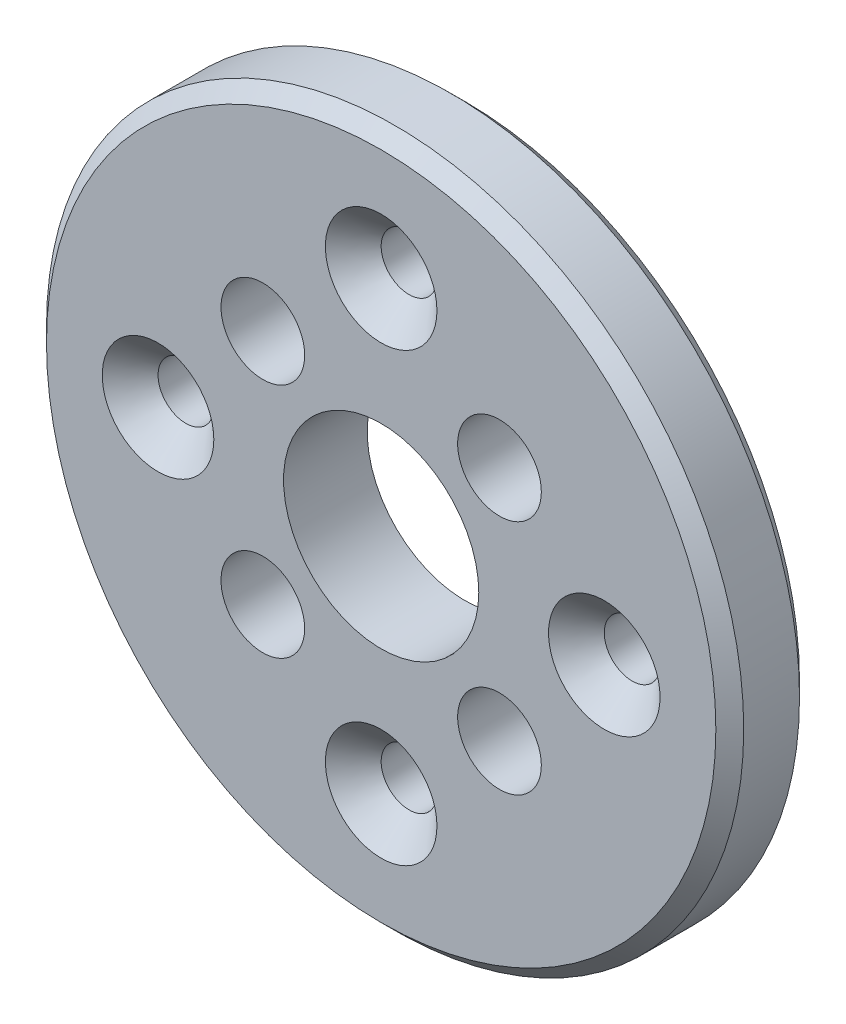
ISO-10303-21;
HEADER;
FILE_DESCRIPTION(('STEP AP214'),'2;1');
FILE_NAME('part.step','',(''),(''),'','','');
FILE_SCHEMA(('AUTOMOTIVE_DESIGN { 1 0 10303 214 1 1 1 1 }'));
ENDSEC;
DATA;
#1=APPLICATION_CONTEXT('core data for automotive mechanical design processes');
#2=APPLICATION_PROTOCOL_DEFINITION('international standard','automotive_design',2000,#1);
#3=PRODUCT_CONTEXT('',#1,'mechanical');
#4=PRODUCT('Part','Part','',(#3));
#5=PRODUCT_RELATED_PRODUCT_CATEGORY('part','',(#4));
#6=PRODUCT_DEFINITION_FORMATION('','',#4);
#7=PRODUCT_DEFINITION_CONTEXT('part definition',#1,'design');
#8=PRODUCT_DEFINITION('design','',#6,#7);
#9=PRODUCT_DEFINITION_SHAPE('','',#8);
#10=(LENGTH_UNIT() NAMED_UNIT(*) SI_UNIT(.MILLI.,.METRE.));
#11=(NAMED_UNIT(*) PLANE_ANGLE_UNIT() SI_UNIT($,.RADIAN.));
#12=(NAMED_UNIT(*) SI_UNIT($,.STERADIAN.) SOLID_ANGLE_UNIT());
#13=UNCERTAINTY_MEASURE_WITH_UNIT(LENGTH_MEASURE(1.E-05),#10,'distance_accuracy_value','');
#14=(GEOMETRIC_REPRESENTATION_CONTEXT(3) GLOBAL_UNCERTAINTY_ASSIGNED_CONTEXT((#13)) GLOBAL_UNIT_ASSIGNED_CONTEXT((#10,
#11,#12)) REPRESENTATION_CONTEXT('',''));
#15=CARTESIAN_POINT('',(0.,0.,0.));
#16=DIRECTION('',(0.,0.,1.));
#17=DIRECTION('',(1.,0.,0.));
#18=AXIS2_PLACEMENT_3D('',#15,#16,#17);
#19=CARTESIAN_POINT('',(0.,0.,1.5));
#20=DIRECTION('',(0.,0.,1.));
#21=DIRECTION('',(1.,0.,0.));
#22=AXIS2_PLACEMENT_3D('',#19,#20,#21);
#23=PLANE('',#22);
#24=CARTESIAN_POINT('',(0.,0.,1.5));
#25=DIRECTION('',(0.,0.,1.));
#26=DIRECTION('',(1.,0.,0.));
#27=AXIS2_PLACEMENT_3D('',#24,#25,#26);
#28=CIRCLE('',#27,12.);
#29=CARTESIAN_POINT('',(12.,0.,1.5));
#30=VERTEX_POINT('',#29);
#31=EDGE_CURVE('E10',#30,#30,#28,.T.);
#32=ORIENTED_EDGE('',*,*,#31,.T.);
#33=EDGE_LOOP('',(#32));
#34=FACE_BOUND('',#33,.T.);
#35=CARTESIAN_POINT('',(8.00000000000023,2.25904099284255E-13,1.5));
#36=DIRECTION('',(0.,0.,1.));
#37=DIRECTION('',(1.,0.,0.));
#38=AXIS2_PLACEMENT_3D('',#35,#36,#37);
#39=CIRCLE('',#38,2.00000000000018);
#40=CARTESIAN_POINT('',(10.0000000000004,2.25904099284255E-13,1.5));
#41=VERTEX_POINT('',#40);
#42=EDGE_CURVE('E78',#41,#41,#39,.F.);
#43=ORIENTED_EDGE('',*,*,#42,.T.);
#44=EDGE_LOOP('',(#43));
#45=FACE_BOUND('',#44,.T.);
#46=CARTESIAN_POINT('',(4.51808198568511E-13,-8.,1.5));
#47=DIRECTION('',(0.,0.,1.));
#48=DIRECTION('',(1.,0.,0.));
#49=AXIS2_PLACEMENT_3D('',#46,#47,#48);
#50=CIRCLE('',#49,2.00000000000049);
#51=CARTESIAN_POINT('',(2.00000000000094,-8.,1.5));
#52=VERTEX_POINT('',#51);
#53=EDGE_CURVE('E82',#52,#52,#50,.F.);
#54=ORIENTED_EDGE('',*,*,#53,.T.);
#55=EDGE_LOOP('',(#54));
#56=FACE_BOUND('',#55,.T.);
#57=CARTESIAN_POINT('',(-7.99999999999977,-2.26883816723573E-13,1.5));
#58=DIRECTION('',(0.,0.,1.));
#59=DIRECTION('',(1.,0.,0.));
#60=AXIS2_PLACEMENT_3D('',#57,#58,#59);
#61=CIRCLE('',#60,2.00000000000037);
#62=CARTESIAN_POINT('',(-5.99999999999941,-2.26883816723573E-13,1.5));
#63=VERTEX_POINT('',#62);
#64=EDGE_CURVE('E86',#63,#63,#61,.F.);
#65=ORIENTED_EDGE('',*,*,#64,.T.);
#66=EDGE_LOOP('',(#65));
#67=FACE_BOUND('',#66,.T.);
#68=CARTESIAN_POINT('',(0.,8.,1.5));
#69=DIRECTION('',(0.,0.,1.));
#70=DIRECTION('',(1.,0.,0.));
#71=AXIS2_PLACEMENT_3D('',#68,#69,#70);
#72=CIRCLE('',#71,2.);
#73=CARTESIAN_POINT('',(2.,8.,1.5));
#74=VERTEX_POINT('',#73);
#75=EDGE_CURVE('E90',#74,#74,#72,.F.);
#76=ORIENTED_EDGE('',*,*,#75,.T.);
#77=EDGE_LOOP('',(#76));
#78=FACE_BOUND('',#77,.T.);
#79=CARTESIAN_POINT('',(4.24264068711926,-4.24264068711931,1.5));
#80=DIRECTION('',(0.,0.,1.));
#81=DIRECTION('',(1.,0.,0.));
#82=AXIS2_PLACEMENT_3D('',#79,#80,#81);
#83=CIRCLE('',#82,1.5);
#84=CARTESIAN_POINT('',(5.74264068711926,-4.24264068711931,1.5));
#85=VERTEX_POINT('',#84);
#86=EDGE_CURVE('E135',#85,#85,#83,.T.);
#87=ORIENTED_EDGE('',*,*,#86,.F.);
#88=EDGE_LOOP('',(#87));
#89=FACE_BOUND('',#88,.T.);
#90=CARTESIAN_POINT('',(0.,0.,1.5));
#91=DIRECTION('',(0.,0.,1.));
#92=DIRECTION('',(1.,0.,0.));
#93=AXIS2_PLACEMENT_3D('',#90,#91,#92);
#94=CIRCLE('',#93,3.5);
#95=CARTESIAN_POINT('',(3.5,0.,1.5));
#96=VERTEX_POINT('',#95);
#97=EDGE_CURVE('E119',#96,#96,#94,.T.);
#98=ORIENTED_EDGE('',*,*,#97,.F.);
#99=EDGE_LOOP('',(#98));
#100=FACE_BOUND('',#99,.T.);
#101=CARTESIAN_POINT('',(-4.24264068711929,4.24264068711928,1.5));
#102=DIRECTION('',(0.,0.,1.));
#103=DIRECTION('',(1.,0.,0.));
#104=AXIS2_PLACEMENT_3D('',#101,#102,#103);
#105=CIRCLE('',#104,1.5);
#106=CARTESIAN_POINT('',(-2.74264068711929,4.24264068711928,1.5));
#107=VERTEX_POINT('',#106);
#108=EDGE_CURVE('E114',#107,#107,#105,.T.);
#109=ORIENTED_EDGE('',*,*,#108,.F.);
#110=EDGE_LOOP('',(#109));
#111=FACE_BOUND('',#110,.T.);
#112=CARTESIAN_POINT('',(4.24264068711929,4.24264068711928,1.5));
#113=DIRECTION('',(0.,0.,1.));
#114=DIRECTION('',(1.,0.,0.));
#115=AXIS2_PLACEMENT_3D('',#112,#113,#114);
#116=CIRCLE('',#115,1.5);
#117=CARTESIAN_POINT('',(5.74264068711929,4.24264068711928,1.5));
#118=VERTEX_POINT('',#117);
#119=EDGE_CURVE('E127',#118,#118,#116,.T.);
#120=ORIENTED_EDGE('',*,*,#119,.F.);
#121=EDGE_LOOP('',(#120));
#122=FACE_BOUND('',#121,.T.);
#123=CARTESIAN_POINT('',(-4.24264068711932,-4.24264068711925,1.5));
#124=DIRECTION('',(0.,0.,1.));
#125=DIRECTION('',(1.,0.,0.));
#126=AXIS2_PLACEMENT_3D('',#123,#124,#125);
#127=CIRCLE('',#126,1.5);
#128=CARTESIAN_POINT('',(-2.74264068711932,-4.24264068711925,1.5));
#129=VERTEX_POINT('',#128);
#130=EDGE_CURVE('E143',#129,#129,#127,.T.);
#131=ORIENTED_EDGE('',*,*,#130,.F.);
#132=EDGE_LOOP('',(#131));
#133=FACE_BOUND('',#132,.T.);
#134=ADVANCED_FACE('F41',(#34,#45,#56,#67,#78,#89,#100,#111,#122,#133),#23,.T.);
#135=CARTESIAN_POINT('',(0.,0.,-1.5));
#136=DIRECTION('',(0.,0.,1.));
#137=DIRECTION('',(1.,0.,0.));
#138=AXIS2_PLACEMENT_3D('',#135,#136,#137);
#139=PLANE('',#138);
#140=CARTESIAN_POINT('',(0.,0.,-1.5));
#141=DIRECTION('',(0.,0.,1.));
#142=DIRECTION('',(1.,0.,0.));
#143=AXIS2_PLACEMENT_3D('',#140,#141,#142);
#144=CIRCLE('',#143,12.);
#145=CARTESIAN_POINT('',(12.,0.,-1.5));
#146=VERTEX_POINT('',#145);
#147=EDGE_CURVE('E50',#146,#146,#144,.F.);
#148=ORIENTED_EDGE('',*,*,#147,.T.);
#149=EDGE_LOOP('',(#148));
#150=FACE_BOUND('',#149,.T.);
#151=CARTESIAN_POINT('',(0.,8.,-1.5));
#152=DIRECTION('',(0.,0.,1.));
#153=DIRECTION('',(1.,0.,0.));
#154=AXIS2_PLACEMENT_3D('',#151,#152,#153);
#155=CIRCLE('',#154,1.);
#156=CARTESIAN_POINT('',(1.,8.,-1.5));
#157=VERTEX_POINT('',#156);
#158=EDGE_CURVE('E98',#157,#157,#155,.T.);
#159=ORIENTED_EDGE('',*,*,#158,.T.);
#160=EDGE_LOOP('',(#159));
#161=FACE_BOUND('',#160,.T.);
#162=CARTESIAN_POINT('',(8.00000000000023,2.25904099284255E-13,-1.5));
#163=DIRECTION('',(0.,0.,1.));
#164=DIRECTION('',(1.,0.,0.));
#165=AXIS2_PLACEMENT_3D('',#162,#163,#164);
#166=CIRCLE('',#165,1.00000000000018);
#167=CARTESIAN_POINT('',(9.0000000000004,2.25904099284255E-13,-1.5));
#168=VERTEX_POINT('',#167);
#169=EDGE_CURVE('E102',#168,#168,#166,.T.);
#170=ORIENTED_EDGE('',*,*,#169,.T.);
#171=EDGE_LOOP('',(#170));
#172=FACE_BOUND('',#171,.T.);
#173=CARTESIAN_POINT('',(4.51808198568511E-13,-8.,-1.5));
#174=DIRECTION('',(0.,0.,1.));
#175=DIRECTION('',(1.,0.,0.));
#176=AXIS2_PLACEMENT_3D('',#173,#174,#175);
#177=CIRCLE('',#176,1.00000000000049);
#178=CARTESIAN_POINT('',(1.00000000000094,-8.,-1.5));
#179=VERTEX_POINT('',#178);
#180=EDGE_CURVE('E106',#179,#179,#177,.T.);
#181=ORIENTED_EDGE('',*,*,#180,.T.);
#182=EDGE_LOOP('',(#181));
#183=FACE_BOUND('',#182,.T.);
#184=CARTESIAN_POINT('',(-7.99999999999977,-2.26883816723573E-13,-1.5));
#185=DIRECTION('',(0.,0.,1.));
#186=DIRECTION('',(1.,0.,0.));
#187=AXIS2_PLACEMENT_3D('',#184,#185,#186);
#188=CIRCLE('',#187,1.00000000000036);
#189=CARTESIAN_POINT('',(-6.99999999999941,-2.26883816723573E-13,-1.5));
#190=VERTEX_POINT('',#189);
#191=EDGE_CURVE('E110',#190,#190,#188,.T.);
#192=ORIENTED_EDGE('',*,*,#191,.T.);
#193=EDGE_LOOP('',(#192));
#194=FACE_BOUND('',#193,.T.);
#195=CARTESIAN_POINT('',(-4.24264068711929,4.24264068711928,-1.5));
#196=DIRECTION('',(0.,0.,1.));
#197=DIRECTION('',(1.,0.,0.));
#198=AXIS2_PLACEMENT_3D('',#195,#196,#197);
#199=CIRCLE('',#198,1.5);
#200=CARTESIAN_POINT('',(-2.74264068711929,4.24264068711928,-1.5));
#201=VERTEX_POINT('',#200);
#202=EDGE_CURVE('E115',#201,#201,#199,.T.);
#203=ORIENTED_EDGE('',*,*,#202,.T.);
#204=EDGE_LOOP('',(#203));
#205=FACE_BOUND('',#204,.T.);
#206=CARTESIAN_POINT('',(0.,0.,-1.5));
#207=DIRECTION('',(0.,0.,1.));
#208=DIRECTION('',(1.,0.,0.));
#209=AXIS2_PLACEMENT_3D('',#206,#207,#208);
#210=CIRCLE('',#209,3.5);
#211=CARTESIAN_POINT('',(3.5,0.,-1.5));
#212=VERTEX_POINT('',#211);
#213=EDGE_CURVE('E123',#212,#212,#210,.T.);
#214=ORIENTED_EDGE('',*,*,#213,.T.);
#215=EDGE_LOOP('',(#214));
#216=FACE_BOUND('',#215,.T.);
#217=CARTESIAN_POINT('',(4.24264068711929,4.24264068711928,-1.5));
#218=DIRECTION('',(0.,0.,1.));
#219=DIRECTION('',(1.,0.,0.));
#220=AXIS2_PLACEMENT_3D('',#217,#218,#219);
#221=CIRCLE('',#220,1.5);
#222=CARTESIAN_POINT('',(5.74264068711929,4.24264068711928,-1.5));
#223=VERTEX_POINT('',#222);
#224=EDGE_CURVE('E131',#223,#223,#221,.T.);
#225=ORIENTED_EDGE('',*,*,#224,.T.);
#226=EDGE_LOOP('',(#225));
#227=FACE_BOUND('',#226,.T.);
#228=CARTESIAN_POINT('',(4.24264068711926,-4.24264068711931,-1.5));
#229=DIRECTION('',(0.,0.,1.));
#230=DIRECTION('',(1.,0.,0.));
#231=AXIS2_PLACEMENT_3D('',#228,#229,#230);
#232=CIRCLE('',#231,1.5);
#233=CARTESIAN_POINT('',(5.74264068711926,-4.24264068711931,-1.5));
#234=VERTEX_POINT('',#233);
#235=EDGE_CURVE('E139',#234,#234,#232,.T.);
#236=ORIENTED_EDGE('',*,*,#235,.T.);
#237=EDGE_LOOP('',(#236));
#238=FACE_BOUND('',#237,.T.);
#239=CARTESIAN_POINT('',(-4.24264068711932,-4.24264068711925,-1.5));
#240=DIRECTION('',(0.,0.,1.));
#241=DIRECTION('',(1.,0.,0.));
#242=AXIS2_PLACEMENT_3D('',#239,#240,#241);
#243=CIRCLE('',#242,1.5);
#244=CARTESIAN_POINT('',(-2.74264068711932,-4.24264068711925,-1.5));
#245=VERTEX_POINT('',#244);
#246=EDGE_CURVE('E147',#245,#245,#243,.T.);
#247=ORIENTED_EDGE('',*,*,#246,.T.);
#248=EDGE_LOOP('',(#247));
#249=FACE_BOUND('',#248,.T.);
#250=ADVANCED_FACE('F159',(#150,#161,#172,#183,#194,#205,#216,#227,#238,#249),#139,.F.);
#251=CARTESIAN_POINT('',(0.,0.,1.5));
#252=DIRECTION('',(0.,0.,-1.));
#253=DIRECTION('',(-1.,0.,0.));
#254=AXIS2_PLACEMENT_3D('',#251,#252,#253);
#255=CYLINDRICAL_SURFACE('',#254,12.5);
#256=CARTESIAN_POINT('',(0.,0.,-0.999999999999998));
#257=DIRECTION('',(0.,0.,1.));
#258=DIRECTION('',(1.,0.,0.));
#259=AXIS2_PLACEMENT_3D('',#256,#257,#258);
#260=CIRCLE('',#259,12.5);
#261=CARTESIAN_POINT('',(12.5,0.,-0.999999999999998));
#262=VERTEX_POINT('',#261);
#263=EDGE_CURVE('E55',#262,#262,#260,.T.);
#264=ORIENTED_EDGE('',*,*,#263,.T.);
#265=EDGE_LOOP('',(#264));
#266=FACE_BOUND('',#265,.T.);
#267=CARTESIAN_POINT('',(0.,0.,0.999999999999998));
#268=DIRECTION('',(0.,0.,1.));
#269=DIRECTION('',(1.,0.,0.));
#270=AXIS2_PLACEMENT_3D('',#267,#268,#269);
#271=CIRCLE('',#270,12.5);
#272=CARTESIAN_POINT('',(12.5,0.,0.999999999999998));
#273=VERTEX_POINT('',#272);
#274=EDGE_CURVE('E60',#273,#273,#271,.F.);
#275=ORIENTED_EDGE('',*,*,#274,.T.);
#276=EDGE_LOOP('',(#275));
#277=FACE_BOUND('',#276,.T.);
#278=ADVANCED_FACE('F164',(#266,#277),#255,.T.);
#279=CARTESIAN_POINT('',(0.,8.,1.5));
#280=DIRECTION('',(0.,0.,-1.));
#281=DIRECTION('',(-1.,0.,0.));
#282=AXIS2_PLACEMENT_3D('',#279,#280,#281);
#283=CYLINDRICAL_SURFACE('',#282,1.);
#284=CARTESIAN_POINT('',(0.,8.,0.500000000000002));
#285=DIRECTION('',(0.,0.,1.));
#286=DIRECTION('',(1.,0.,0.));
#287=AXIS2_PLACEMENT_3D('',#284,#285,#286);
#288=CIRCLE('',#287,1.);
#289=CARTESIAN_POINT('',(1.,8.,0.500000000000002));
#290=VERTEX_POINT('',#289);
#291=EDGE_CURVE('E66',#290,#290,#288,.T.);
#292=ORIENTED_EDGE('',*,*,#291,.T.);
#293=EDGE_LOOP('',(#292));
#294=FACE_BOUND('',#293,.T.);
#295=ORIENTED_EDGE('',*,*,#158,.F.);
#296=EDGE_LOOP('',(#295));
#297=FACE_BOUND('',#296,.T.);
#298=ADVANCED_FACE('F168',(#294,#297),#283,.F.);
#299=CARTESIAN_POINT('',(8.00000000000023,2.25904099284255E-13,1.5));
#300=DIRECTION('',(0.,0.,-1.));
#301=DIRECTION('',(-1.,0.,0.));
#302=AXIS2_PLACEMENT_3D('',#299,#300,#301);
#303=CYLINDRICAL_SURFACE('',#302,1.00000000000018);
#304=CARTESIAN_POINT('',(8.00000000000023,2.25904099284255E-13,0.500000000000002));
#305=DIRECTION('',(0.,0.,1.));
#306=DIRECTION('',(1.,0.,0.));
#307=AXIS2_PLACEMENT_3D('',#304,#305,#306);
#308=CIRCLE('',#307,1.00000000000018);
#309=CARTESIAN_POINT('',(9.0000000000004,2.25904099284255E-13,0.500000000000002));
#310=VERTEX_POINT('',#309);
#311=EDGE_CURVE('E94',#310,#310,#308,.T.);
#312=ORIENTED_EDGE('',*,*,#311,.T.);
#313=EDGE_LOOP('',(#312));
#314=FACE_BOUND('',#313,.T.);
#315=ORIENTED_EDGE('',*,*,#169,.F.);
#316=EDGE_LOOP('',(#315));
#317=FACE_BOUND('',#316,.T.);
#318=ADVANCED_FACE('F289',(#314,#317),#303,.F.);
#319=CARTESIAN_POINT('',(4.51808198568511E-13,-8.,1.5));
#320=DIRECTION('',(0.,0.,-1.));
#321=DIRECTION('',(-1.,0.,0.));
#322=AXIS2_PLACEMENT_3D('',#319,#320,#321);
#323=CYLINDRICAL_SURFACE('',#322,1.00000000000049);
#324=CARTESIAN_POINT('',(4.51808198568511E-13,-8.,0.499999999999998));
#325=DIRECTION('',(0.,0.,1.));
#326=DIRECTION('',(1.,0.,0.));
#327=AXIS2_PLACEMENT_3D('',#324,#325,#326);
#328=CIRCLE('',#327,1.00000000000049);
#329=CARTESIAN_POINT('',(1.00000000000094,-8.,0.499999999999998));
#330=VERTEX_POINT('',#329);
#331=EDGE_CURVE('E74',#330,#330,#328,.T.);
#332=ORIENTED_EDGE('',*,*,#331,.T.);
#333=EDGE_LOOP('',(#332));
#334=FACE_BOUND('',#333,.T.);
#335=ORIENTED_EDGE('',*,*,#180,.F.);
#336=EDGE_LOOP('',(#335));
#337=FACE_BOUND('',#336,.T.);
#338=ADVANCED_FACE('F277',(#334,#337),#323,.F.);
#339=CARTESIAN_POINT('',(-7.99999999999977,-2.26883816723573E-13,1.5));
#340=DIRECTION('',(0.,0.,-1.));
#341=DIRECTION('',(-1.,0.,0.));
#342=AXIS2_PLACEMENT_3D('',#339,#340,#341);
#343=CYLINDRICAL_SURFACE('',#342,1.00000000000036);
#344=CARTESIAN_POINT('',(-7.99999999999977,-2.26883816723573E-13,0.5));
#345=DIRECTION('',(0.,0.,1.));
#346=DIRECTION('',(1.,0.,0.));
#347=AXIS2_PLACEMENT_3D('',#344,#345,#346);
#348=CIRCLE('',#347,1.00000000000036);
#349=CARTESIAN_POINT('',(-6.99999999999941,-2.26883816723573E-13,0.5));
#350=VERTEX_POINT('',#349);
#351=EDGE_CURVE('E70',#350,#350,#348,.T.);
#352=ORIENTED_EDGE('',*,*,#351,.T.);
#353=EDGE_LOOP('',(#352));
#354=FACE_BOUND('',#353,.T.);
#355=ORIENTED_EDGE('',*,*,#191,.F.);
#356=EDGE_LOOP('',(#355));
#357=FACE_BOUND('',#356,.T.);
#358=ADVANCED_FACE('F271',(#354,#357),#343,.F.);
#359=CARTESIAN_POINT('',(-4.24264068711929,4.24264068711928,1.5));
#360=DIRECTION('',(0.,0.,-1.));
#361=DIRECTION('',(-1.,0.,0.));
#362=AXIS2_PLACEMENT_3D('',#359,#360,#361);
#363=CYLINDRICAL_SURFACE('',#362,1.5);
#364=ORIENTED_EDGE('',*,*,#108,.T.);
#365=EDGE_LOOP('',(#364));
#366=FACE_BOUND('',#365,.T.);
#367=ORIENTED_EDGE('',*,*,#202,.F.);
#368=EDGE_LOOP('',(#367));
#369=FACE_BOUND('',#368,.T.);
#370=ADVANCED_FACE('F276',(#366,#369),#363,.F.);
#371=CARTESIAN_POINT('',(0.,0.,1.5));
#372=DIRECTION('',(0.,0.,-1.));
#373=DIRECTION('',(-1.,0.,0.));
#374=AXIS2_PLACEMENT_3D('',#371,#372,#373);
#375=CYLINDRICAL_SURFACE('',#374,3.5);
#376=ORIENTED_EDGE('',*,*,#97,.T.);
#377=EDGE_LOOP('',(#376));
#378=FACE_BOUND('',#377,.T.);
#379=ORIENTED_EDGE('',*,*,#213,.F.);
#380=EDGE_LOOP('',(#379));
#381=FACE_BOUND('',#380,.T.);
#382=ADVANCED_FACE('F330',(#378,#381),#375,.F.);
#383=CARTESIAN_POINT('',(4.24264068711929,4.24264068711928,1.5));
#384=DIRECTION('',(0.,0.,-1.));
#385=DIRECTION('',(-1.,0.,0.));
#386=AXIS2_PLACEMENT_3D('',#383,#384,#385);
#387=CYLINDRICAL_SURFACE('',#386,1.5);
#388=ORIENTED_EDGE('',*,*,#119,.T.);
#389=EDGE_LOOP('',(#388));
#390=FACE_BOUND('',#389,.T.);
#391=ORIENTED_EDGE('',*,*,#224,.F.);
#392=EDGE_LOOP('',(#391));
#393=FACE_BOUND('',#392,.T.);
#394=ADVANCED_FACE('F320',(#390,#393),#387,.F.);
#395=CARTESIAN_POINT('',(4.24264068711926,-4.24264068711931,1.5));
#396=DIRECTION('',(0.,0.,-1.));
#397=DIRECTION('',(-1.,0.,0.));
#398=AXIS2_PLACEMENT_3D('',#395,#396,#397);
#399=CYLINDRICAL_SURFACE('',#398,1.5);
#400=ORIENTED_EDGE('',*,*,#86,.T.);
#401=EDGE_LOOP('',(#400));
#402=FACE_BOUND('',#401,.T.);
#403=ORIENTED_EDGE('',*,*,#235,.F.);
#404=EDGE_LOOP('',(#403));
#405=FACE_BOUND('',#404,.T.);
#406=ADVANCED_FACE('F311',(#402,#405),#399,.F.);
#407=CARTESIAN_POINT('',(-4.24264068711932,-4.24264068711925,1.5));
#408=DIRECTION('',(0.,0.,-1.));
#409=DIRECTION('',(-1.,0.,0.));
#410=AXIS2_PLACEMENT_3D('',#407,#408,#409);
#411=CYLINDRICAL_SURFACE('',#410,1.5);
#412=ORIENTED_EDGE('',*,*,#130,.T.);
#413=EDGE_LOOP('',(#412));
#414=FACE_BOUND('',#413,.T.);
#415=ORIENTED_EDGE('',*,*,#246,.F.);
#416=EDGE_LOOP('',(#415));
#417=FACE_BOUND('',#416,.T.);
#418=ADVANCED_FACE('F155',(#414,#417),#411,.F.);
#419=CARTESIAN_POINT('',(8.00000000000023,2.25904099284255E-13,0.500000000000002));
#420=DIRECTION('',(0.,0.,1.));
#421=DIRECTION('',(1.,0.,0.));
#422=AXIS2_PLACEMENT_3D('',#419,#420,#421);
#423=CONICAL_SURFACE('',#422,1.00000000000018,0.78539816339745);
#424=ORIENTED_EDGE('',*,*,#42,.F.);
#425=EDGE_LOOP('',(#424));
#426=FACE_BOUND('',#425,.T.);
#427=ORIENTED_EDGE('',*,*,#311,.F.);
#428=EDGE_LOOP('',(#427));
#429=FACE_BOUND('',#428,.T.);
#430=ADVANCED_FACE('F175',(#426,#429),#423,.F.);
#431=CARTESIAN_POINT('',(4.51808198568511E-13,-8.,0.499999999999998));
#432=DIRECTION('',(0.,0.,1.));
#433=DIRECTION('',(1.,0.,0.));
#434=AXIS2_PLACEMENT_3D('',#431,#432,#433);
#435=CONICAL_SURFACE('',#434,1.00000000000049,0.78539816339745);
#436=ORIENTED_EDGE('',*,*,#53,.F.);
#437=EDGE_LOOP('',(#436));
#438=FACE_BOUND('',#437,.T.);
#439=ORIENTED_EDGE('',*,*,#331,.F.);
#440=EDGE_LOOP('',(#439));
#441=FACE_BOUND('',#440,.T.);
#442=ADVANCED_FACE('F181',(#438,#441),#435,.F.);
#443=CARTESIAN_POINT('',(-7.99999999999977,-2.26883816723573E-13,0.5));
#444=DIRECTION('',(0.,0.,1.));
#445=DIRECTION('',(1.,0.,0.));
#446=AXIS2_PLACEMENT_3D('',#443,#444,#445);
#447=CONICAL_SURFACE('',#446,1.00000000000036,0.78539816339745);
#448=ORIENTED_EDGE('',*,*,#64,.F.);
#449=EDGE_LOOP('',(#448));
#450=FACE_BOUND('',#449,.T.);
#451=ORIENTED_EDGE('',*,*,#351,.F.);
#452=EDGE_LOOP('',(#451));
#453=FACE_BOUND('',#452,.T.);
#454=ADVANCED_FACE('F188',(#450,#453),#447,.F.);
#455=CARTESIAN_POINT('',(0.,8.,0.500000000000002));
#456=DIRECTION('',(0.,0.,1.));
#457=DIRECTION('',(1.,0.,0.));
#458=AXIS2_PLACEMENT_3D('',#455,#456,#457);
#459=CONICAL_SURFACE('',#458,1.,0.78539816339745);
#460=ORIENTED_EDGE('',*,*,#75,.F.);
#461=EDGE_LOOP('',(#460));
#462=FACE_BOUND('',#461,.T.);
#463=ORIENTED_EDGE('',*,*,#291,.F.);
#464=EDGE_LOOP('',(#463));
#465=FACE_BOUND('',#464,.T.);
#466=ADVANCED_FACE('F195',(#462,#465),#459,.F.);
#467=CARTESIAN_POINT('',(0.,0.,-0.999999999999998));
#468=DIRECTION('',(0.,0.,1.));
#469=DIRECTION('',(1.,0.,0.));
#470=AXIS2_PLACEMENT_3D('',#467,#468,#469);
#471=CONICAL_SURFACE('',#470,12.5,0.78539816339745);
#472=ORIENTED_EDGE('',*,*,#147,.F.);
#473=EDGE_LOOP('',(#472));
#474=FACE_BOUND('',#473,.T.);
#475=ORIENTED_EDGE('',*,*,#263,.F.);
#476=EDGE_LOOP('',(#475));
#477=FACE_BOUND('',#476,.T.);
#478=ADVANCED_FACE('F201',(#474,#477),#471,.T.);
#479=CARTESIAN_POINT('',(0.,0.,1.5));
#480=DIRECTION('',(0.,0.,-1.));
#481=DIRECTION('',(-1.,0.,0.));
#482=AXIS2_PLACEMENT_3D('',#479,#480,#481);
#483=CONICAL_SURFACE('',#482,12.,0.78539816339745);
#484=ORIENTED_EDGE('',*,*,#274,.F.);
#485=EDGE_LOOP('',(#484));
#486=FACE_BOUND('',#485,.T.);
#487=ORIENTED_EDGE('',*,*,#31,.F.);
#488=EDGE_LOOP('',(#487));
#489=FACE_BOUND('',#488,.T.);
#490=ADVANCED_FACE('F44',(#486,#489),#483,.T.);
#491=CLOSED_SHELL('',(#134,#250,#278,#298,#318,#338,#358,#370,#382,#394,#406,#418,#430,#442,
#454,#466,#478,#490));
#492=MANIFOLD_SOLID_BREP('B2',#491);
#493=ADVANCED_BREP_SHAPE_REPRESENTATION('',(#18,#492),#14);
#494=SHAPE_DEFINITION_REPRESENTATION(#9,#493);
ENDSEC;
END-ISO-10303-21;
